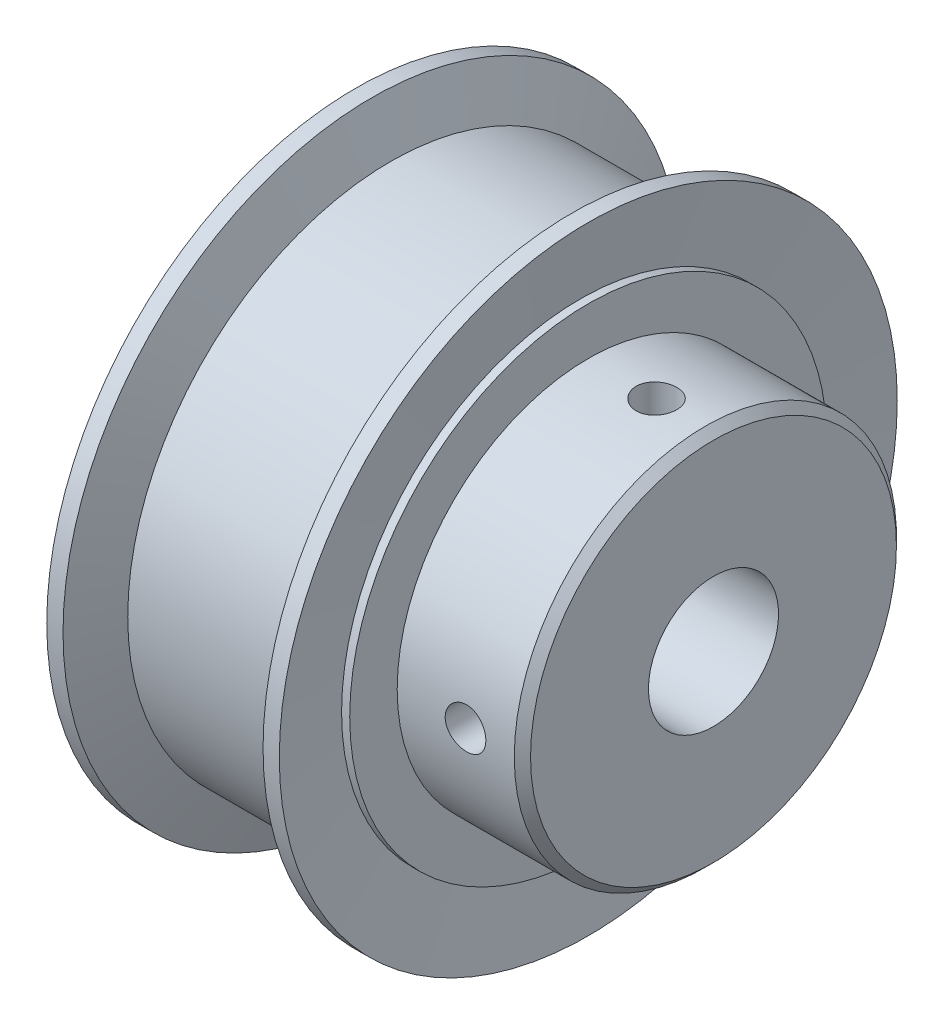
ISO-10303-21;
HEADER;
FILE_DESCRIPTION(('STEP AP214'),'2;1');
FILE_NAME('part.step','',(''),(''),'','','');
FILE_SCHEMA(('AUTOMOTIVE_DESIGN { 1 0 10303 214 1 1 1 1 }'));
ENDSEC;
DATA;
#1=APPLICATION_CONTEXT('core data for automotive mechanical design processes');
#2=APPLICATION_PROTOCOL_DEFINITION('international standard','automotive_design',2000,#1);
#3=PRODUCT_CONTEXT('',#1,'mechanical');
#4=PRODUCT('Part','Part','',(#3));
#5=PRODUCT_RELATED_PRODUCT_CATEGORY('part','',(#4));
#6=PRODUCT_DEFINITION_FORMATION('','',#4);
#7=PRODUCT_DEFINITION_CONTEXT('part definition',#1,'design');
#8=PRODUCT_DEFINITION('design','',#6,#7);
#9=PRODUCT_DEFINITION_SHAPE('','',#8);
#10=(LENGTH_UNIT() NAMED_UNIT(*) SI_UNIT(.MILLI.,.METRE.));
#11=(NAMED_UNIT(*) PLANE_ANGLE_UNIT() SI_UNIT($,.RADIAN.));
#12=(NAMED_UNIT(*) SI_UNIT($,.STERADIAN.) SOLID_ANGLE_UNIT());
#13=UNCERTAINTY_MEASURE_WITH_UNIT(LENGTH_MEASURE(1.E-05),#10,'distance_accuracy_value','');
#14=(GEOMETRIC_REPRESENTATION_CONTEXT(3) GLOBAL_UNCERTAINTY_ASSIGNED_CONTEXT((#13)) GLOBAL_UNIT_ASSIGNED_CONTEXT((#10,
#11,#12)) REPRESENTATION_CONTEXT('',''));
#15=CARTESIAN_POINT('',(0.,0.,0.));
#16=DIRECTION('',(0.,0.,1.));
#17=DIRECTION('',(1.,0.,0.));
#18=AXIS2_PLACEMENT_3D('',#15,#16,#17);
#19=CARTESIAN_POINT('',(0.,0.,0.));
#20=DIRECTION('',(-1.,0.,0.));
#21=DIRECTION('',(0.,0.,1.));
#22=AXIS2_PLACEMENT_3D('',#19,#20,#21);
#23=CYLINDRICAL_SURFACE('',#22,4.);
#24=CARTESIAN_POINT('',(11.35,3.79967103839267,1.24999999999998));
#25=CARTESIAN_POINT('',(11.4183470361093,3.79967145961937,1.24999953780045));
#26=CARTESIAN_POINT('',(11.4866987687032,3.80153531505043,1.24437538791492));
#27=CARTESIAN_POINT('',(11.6213941608778,3.80875638998877,1.22209175401325));
#28=CARTESIAN_POINT('',(11.6877372727322,3.81411455353136,1.20542928782513));
#29=CARTESIAN_POINT('',(11.816444901932,3.8276593883596,1.16169788223557));
#30=CARTESIAN_POINT('',(11.8788162331057,3.83584105194317,1.13464735736675));
#31=CARTESIAN_POINT('',(11.998152695864,3.85410406218689,1.07096914173155));
#32=CARTESIAN_POINT('',(12.0551168699601,3.86418574435841,1.0343397590563));
#33=CARTESIAN_POINT('',(12.1639788674935,3.8855012766862,0.951196070622274));
#34=CARTESIAN_POINT('',(12.215663609436,3.89676123384781,0.90440939972038));
#35=CARTESIAN_POINT('',(12.3105960132092,3.91894245860336,0.802862046455477));
#36=CARTESIAN_POINT('',(12.3538424969448,3.92986367872627,0.748100252518549));
#37=CARTESIAN_POINT('',(12.4316110630112,3.95043553390078,0.630625912493347));
#38=CARTESIAN_POINT('',(12.4659137038314,3.9600518456278,0.56776155652008));
#39=CARTESIAN_POINT('',(12.5233760498555,3.97662551833019,0.436804232853389));
#40=CARTESIAN_POINT('',(12.5465383741496,3.98358350419919,0.368712498487037));
#41=CARTESIAN_POINT('',(12.5803511280971,3.99387175820862,0.231464356966084));
#42=CARTESIAN_POINT('',(12.5913657497878,3.99730738984143,0.162405715468202));
#43=CARTESIAN_POINT('',(12.6017243464375,4.00053595876015,0.0233408139845076));
#44=CARTESIAN_POINT('',(12.6010709743588,4.00032972410065,-0.0466652269730958));
#45=CARTESIAN_POINT('',(12.588351708414,3.99637116132537,-0.183074480354746));
#46=CARTESIAN_POINT('',(12.576680616487,3.99274150972157,-0.249518634314055));
#47=CARTESIAN_POINT('',(12.542905009957,3.98249482560854,-0.37945306334778));
#48=CARTESIAN_POINT('',(12.5207998149134,3.97587759827134,-0.442943145481206));
#49=CARTESIAN_POINT('',(12.4665298109251,3.96023459729532,-0.566078103154791));
#50=CARTESIAN_POINT('',(12.434245191437,3.95118033616957,-0.62566640562284));
#51=CARTESIAN_POINT('',(12.3606289002954,3.93161722953562,-0.738702511152038));
#52=CARTESIAN_POINT('',(12.3192949408622,3.92110801644584,-0.792148756208846));
#53=CARTESIAN_POINT('',(12.2267263651987,3.89923670734646,-0.893737698453889));
#54=CARTESIAN_POINT('',(12.1751509311588,3.88785731989083,-0.941566549094186));
#55=CARTESIAN_POINT('',(12.0646048981755,3.86590615440412,-1.02798974259538));
#56=CARTESIAN_POINT('',(12.005633429425,3.85533447159846,-1.06658299775342));
#57=CARTESIAN_POINT('',(11.8810825311402,3.83610846648973,-1.13380465019766));
#58=CARTESIAN_POINT('',(11.8154365909576,3.82747690354323,-1.16231680702683));
#59=CARTESIAN_POINT('',(11.6799405081046,3.81337545338913,-1.20778345948514));
#60=CARTESIAN_POINT('',(11.6100918857895,3.80790443033293,-1.22474210765794));
#61=CARTESIAN_POINT('',(11.4711800474342,3.80099563391872,-1.24601485185709));
#62=CARTESIAN_POINT('',(11.4021980037679,3.79940466389696,-1.25080954353711));
#63=CARTESIAN_POINT('',(11.2644102585018,3.80001077463984,-1.24896744498308));
#64=CARTESIAN_POINT('',(11.1956045312995,3.80220727008389,-1.24233242111456));
#65=CARTESIAN_POINT('',(11.0621917033484,3.80998957482874,-1.21824873513144));
#66=CARTESIAN_POINT('',(10.997520725926,3.81547554101731,-1.20111831160538));
#67=CARTESIAN_POINT('',(10.871978208004,3.8291128733166,-1.15690373661028));
#68=CARTESIAN_POINT('',(10.8111072890788,3.83726467412387,-1.12981796171155));
#69=CARTESIAN_POINT('',(10.6929608902283,3.85560539653156,-1.06557510655875));
#70=CARTESIAN_POINT('',(10.6358385844072,3.86584603489733,-1.02815147488558));
#71=CARTESIAN_POINT('',(10.5285096536381,3.88710348972828,-0.944606408679819));
#72=CARTESIAN_POINT('',(10.4783048310747,3.89812050735702,-0.898482714690792));
#73=CARTESIAN_POINT('',(10.3840896340872,3.92024187562679,-0.796572947753614));
#74=CARTESIAN_POINT('',(10.3404222138601,3.93133092285679,-0.740465649788531));
#75=CARTESIAN_POINT('',(10.2631089566787,3.95189059843678,-0.621451545651409));
#76=CARTESIAN_POINT('',(10.229462660689,3.96136130090946,-0.558545051108635));
#77=CARTESIAN_POINT('',(10.1734694375283,3.97756311928512,-0.428105523331844));
#78=CARTESIAN_POINT('',(10.1510407121563,3.984313995612,-0.360610184283768));
#79=CARTESIAN_POINT('',(10.1179274614103,3.99440242648576,-0.222557254056403));
#80=CARTESIAN_POINT('',(10.1072392609165,3.99774104914277,-0.15200062834037));
#81=CARTESIAN_POINT('',(10.0982089982504,4.00055803404461,-0.0129849366489136));
#82=CARTESIAN_POINT('',(10.0993715498292,4.0001912940739,0.0554391919465069));
#83=CARTESIAN_POINT('',(10.1128118110487,3.99600978081048,0.191073221923232));
#84=CARTESIAN_POINT('',(10.125088795992,3.99219523232619,0.258283202179552));
#85=CARTESIAN_POINT('',(10.1600940092223,3.98159570844796,0.388755118480774));
#86=CARTESIAN_POINT('',(10.1826896078454,3.97484847960205,0.452055918449464));
#87=CARTESIAN_POINT('',(10.2375708272085,3.9590794558795,0.573998425500074));
#88=CARTESIAN_POINT('',(10.2698581099734,3.95005727091358,0.632639331274464));
#89=CARTESIAN_POINT('',(10.3444727583444,3.93029896883376,0.74576169496967));
#90=CARTESIAN_POINT('',(10.387103522464,3.91951509750962,0.800034607053093));
#91=CARTESIAN_POINT('',(10.4806598894435,3.89758736547061,0.9008207913993));
#92=CARTESIAN_POINT('',(10.5315879741394,3.88644339784827,0.947331733504141));
#93=CARTESIAN_POINT('',(10.6423157198411,3.86461892577438,1.03282865911251));
#94=CARTESIAN_POINT('',(10.7023534031166,3.85396600863456,1.07151427994709));
#95=CARTESIAN_POINT('',(10.8283981202691,3.83480125279531,1.13820470748519));
#96=CARTESIAN_POINT('',(10.8944027264503,3.82628854861387,1.16621383403544));
#97=CARTESIAN_POINT('',(11.0247226173147,3.81306560440328,1.2087118043579));
#98=CARTESIAN_POINT('',(11.0887025474516,3.80809315043749,1.22414939837871));
#99=CARTESIAN_POINT('',(11.2184538320965,3.80139606482399,1.24479245816098));
#100=CARTESIAN_POINT('',(11.2842247412015,3.79967063301599,1.25000044480776));
#101=CARTESIAN_POINT('',(11.35,3.79967103839267,1.24999999999998));
#102=B_SPLINE_CURVE_WITH_KNOTS('',3,(#24,#25,#26,#27,#28,#29,#30,#31,#32,#33,#34,#35,#36,#37,
#38,#39,#40,#41,#42,#43,#44,#45,#46,#47,#48,#49,#50,#51,#52,#53,#54,#55,#56,#57,#58,#59,#60,#61,
#62,#63,#64,#65,#66,#67,#68,#69,#70,#71,#72,#73,#74,#75,#76,#77,#78,#79,#80,#81,#82,#83,#84,#85,
#86,#87,#88,#89,#90,#91,#92,#93,#94,#95,#96,#97,#98,#99,#100,#101),.UNSPECIFIED.,.T.,.F.,(4,2,2,
2,2,2,2,2,2,2,2,2,2,2,2,2,2,2,2,2,2,2,2,2,2,2,2,2,2,2,2,2,2,2,2,2,2,2,4),(0.,0.204798137548489,
0.409651627059732,0.614143644118576,0.818671804924942,1.02957080550837,1.24049922941122,
1.45619821963732,1.67184647417921,1.88083722835532,2.08978046471773,2.29150982969749,
2.49325235190092,2.69746404608407,2.90172742713186,3.11450338937332,3.32730439853774,
3.54248470934452,3.7575876395275,3.96404933287933,4.17047912219087,4.37093972044361,
4.57143302253207,4.77767613309608,4.98397288011877,5.19881937811508,5.41365603317083,
5.62690239290995,5.84008198140581,6.04438802439521,6.24868074692303,6.45041846514756,
6.65219079911648,6.86080693105211,7.06948557772186,7.28507795501701,7.50058300803818,
7.69772354371382,7.89481549188775),.UNSPECIFIED.);
#103=CARTESIAN_POINT('',(11.35,3.79967103839267,1.24999999999998));
#104=VERTEX_POINT('',#103);
#105=EDGE_CURVE('E224',#104,#104,#102,.T.);
#106=ORIENTED_EDGE('',*,*,#105,.T.);
#107=EDGE_LOOP('',(#106));
#108=FACE_BOUND('',#107,.T.);
#109=CARTESIAN_POINT('',(12.6,0.,4.));
#110=CARTESIAN_POINT('',(12.5999995534124,0.068439185174546,3.99999965877989));
#111=CARTESIAN_POINT('',(12.5943607730555,0.136883052502858,3.99822694984841));
#112=CARTESIAN_POINT('',(12.5720137584608,0.271769209588446,3.99132894088807));
#113=CARTESIAN_POINT('',(12.5553030186356,0.338211042725905,3.98620288199859));
#114=CARTESIAN_POINT('',(12.5114306288043,0.467128543650804,3.97315815697909));
#115=CARTESIAN_POINT('',(12.484285155347,0.5296101769858,3.96524381499025));
#116=CARTESIAN_POINT('',(12.4203826823217,0.649134802346456,3.94743969161092));
#117=CARTESIAN_POINT('',(12.3836241682194,0.70617693544488,3.93754959899905));
#118=CARTESIAN_POINT('',(12.3003440079826,0.814965334952275,3.91650213740282));
#119=CARTESIAN_POINT('',(12.2535791149389,0.866520028156654,3.90531715926989));
#120=CARTESIAN_POINT('',(12.1521316075864,0.961197382036987,3.88310046374209));
#121=CARTESIAN_POINT('',(12.0974475225054,1.00431847289869,3.87206877523457));
#122=CARTESIAN_POINT('',(11.9800554361919,1.08194336483113,3.85111144698172));
#123=CARTESIAN_POINT('',(11.9171825224728,1.11620784150128,3.84121988301796));
#124=CARTESIAN_POINT('',(11.7862076850181,1.17359741076671,3.82407801799234));
#125=CARTESIAN_POINT('',(11.7181071442061,1.19672543771944,3.81682702128689));
#126=CARTESIAN_POINT('',(11.5807719225479,1.23048459930033,3.80607606984501));
#127=CARTESIAN_POINT('',(11.5116331563611,1.24147110007864,3.80246972929508));
#128=CARTESIAN_POINT('',(11.3724068810881,1.25174555036987,3.7991005514095));
#129=CARTESIAN_POINT('',(11.3023196291783,1.25103660995771,3.79933669227334));
#130=CARTESIAN_POINT('',(11.166125539731,1.23821824732739,3.80353189075438));
#131=CARTESIAN_POINT('',(11.0999708741384,1.22656057869382,3.80734341745949));
#132=CARTESIAN_POINT('',(10.9706078434627,1.19290813355625,3.81802025652489));
#133=CARTESIAN_POINT('',(10.9073997922912,1.1709122584455,3.82488589343115));
#134=CARTESIAN_POINT('',(10.7846480555674,1.11688874681277,3.84101044014296));
#135=CARTESIAN_POINT('',(10.725171389308,1.08471925662081,3.85030284660824));
#136=CARTESIAN_POINT('',(10.6123122321209,1.01136020737848,3.8702185658007));
#137=CARTESIAN_POINT('',(10.5589313297463,0.970168305215767,3.88084222394551));
#138=CARTESIAN_POINT('',(10.457225056583,0.877716954182119,3.90281527800493));
#139=CARTESIAN_POINT('',(10.4092404422203,0.826084570592813,3.91417569605696));
#140=CARTESIAN_POINT('',(10.3225281064203,0.715364408095528,3.9359157075958));
#141=CARTESIAN_POINT('',(10.2838010707808,0.656276077349018,3.94629522838372));
#142=CARTESIAN_POINT('',(10.2164723113987,0.531664610465452,3.96501294890191));
#143=CARTESIAN_POINT('',(10.187951864536,0.466094906919277,3.97333460648208));
#144=CARTESIAN_POINT('',(10.1424469991484,0.330767977782642,3.98687955828554));
#145=CARTESIAN_POINT('',(10.1254590777616,0.261012030724607,3.99210379325151));
#146=CARTESIAN_POINT('',(10.104081957421,0.122185157290344,3.99871389395014));
#147=CARTESIAN_POINT('',(10.0992314564065,0.0531918487888423,4.00024022895439));
#148=CARTESIAN_POINT('',(10.1009662266373,-0.084630305732584,3.99969799730981));
#149=CARTESIAN_POINT('',(10.1075498273226,-0.153459174306504,3.99762995581124));
#150=CARTESIAN_POINT('',(10.1315955926064,-0.28721933297585,3.99022363769771));
#151=CARTESIAN_POINT('',(10.1487832676125,-0.352204978420946,3.98496793110724));
#152=CARTESIAN_POINT('',(10.1932143523667,-0.478351928861363,3.97180121379252));
#153=CARTESIAN_POINT('',(10.2204590040249,-0.539512760449013,3.96388987514203));
#154=CARTESIAN_POINT('',(10.2849732165488,-0.657932406672228,3.94598542759568));
#155=CARTESIAN_POINT('',(10.3224709874972,-0.71505973978795,3.9359462681821));
#156=CARTESIAN_POINT('',(10.406153210117,-0.82236585096009,3.91493410002887));
#157=CARTESIAN_POINT('',(10.4523400177431,-0.87254273804333,3.90396083845862));
#158=CARTESIAN_POINT('',(10.5542588900537,-0.96658746291965,3.88176994885247));
#159=CARTESIAN_POINT('',(10.6102966637453,-1.01012652339773,3.87055986714446));
#160=CARTESIAN_POINT('',(10.7291266163707,-1.08721250244908,3.84961947087602));
#161=CARTESIAN_POINT('',(10.7919186880044,-1.12075957972523,3.839889132814));
#162=CARTESIAN_POINT('',(10.9223451728859,-1.1767008348114,3.82311782360754));
#163=CARTESIAN_POINT('',(10.9899596495047,-1.19913819558885,3.81606646468027));
#164=CARTESIAN_POINT('',(11.1282724933238,-1.23222894320963,3.80551170941212));
#165=CARTESIAN_POINT('',(11.1989696763713,-1.24288681414609,3.80200696302675));
#166=CARTESIAN_POINT('',(11.3380040875542,-1.2517940615754,3.79908292712494));
#167=CARTESIAN_POINT('',(11.4063034538129,-1.25058279621956,3.79948604683077));
#168=CARTESIAN_POINT('',(11.5416745849192,-1.23708818129473,3.80390090472383));
#169=CARTESIAN_POINT('',(11.608746406884,-1.22480534822559,3.80791247457319));
#170=CARTESIAN_POINT('',(11.7387940396018,-1.18987729913377,3.81896814158112));
#171=CARTESIAN_POINT('',(11.801815441096,-1.16738642405943,3.82596698183474));
#172=CARTESIAN_POINT('',(11.9232404135313,-1.11280227335063,3.84219704261348));
#173=CARTESIAN_POINT('',(11.9816430420777,-1.08070704444254,3.85142871716522));
#174=CARTESIAN_POINT('',(12.0946459704406,-1.00635675013474,3.8715348703158));
#175=CARTESIAN_POINT('',(12.1490081295004,-0.963753335241268,3.88245948922441));
#176=CARTESIAN_POINT('',(12.2499863281118,-0.870208996404843,3.90448998821726));
#177=CARTESIAN_POINT('',(12.296600288991,-0.819265842344397,3.91559591606795));
#178=CARTESIAN_POINT('',(12.382282538363,-0.708486662823327,3.93717271952329));
#179=CARTESIAN_POINT('',(12.42105473645,-0.648414574487376,3.94761101730634));
#180=CARTESIAN_POINT('',(12.4878989151394,-0.52227913801365,3.96626769296916));
#181=CARTESIAN_POINT('',(12.5159751021418,-0.456218157795446,3.97448694315832));
#182=CARTESIAN_POINT('',(12.5585913676085,-0.325747635373975,3.98720650733461));
#183=CARTESIAN_POINT('',(12.5740748673053,-0.261670337112544,3.99196240806139));
#184=CARTESIAN_POINT('',(12.5947783599677,-0.131729895440247,3.99835900340486));
#185=CARTESIAN_POINT('',(12.600000429804,-0.0658671161396743,4.00000032839643));
#186=CARTESIAN_POINT('',(12.6,0.,4.));
#187=B_SPLINE_CURVE_WITH_KNOTS('',3,(#109,#110,#111,#112,#113,#114,#115,#116,#117,#118,#119,
#120,#121,#122,#123,#124,#125,#126,#127,#128,#129,#130,#131,#132,#133,#134,#135,#136,#137,#138,
#139,#140,#141,#142,#143,#144,#145,#146,#147,#148,#149,#150,#151,#152,#153,#154,#155,#156,#157,
#158,#159,#160,#161,#162,#163,#164,#165,#166,#167,#168,#169,#170,#171,#172,#173,#174,#175,#176,
#177,#178,#179,#180,#181,#182,#183,#184,#185,#186),.UNSPECIFIED.,.T.,.F.,(4,2,2,2,2,2,2,2,2,2,2,
2,2,2,2,2,2,2,2,2,2,2,2,2,2,2,2,2,2,2,2,2,2,2,2,2,2,2,4),(0.,0.205075449432509,
0.410197323349064,0.615002479202432,0.819839921558386,1.03037822195158,1.24095567431275,
1.45673771247493,1.67246286279526,1.88169150167209,2.09086450295137,2.29176917422168,
2.49269519979061,2.69655642720544,2.90047066010357,3.11366747279598,3.32688007413301,
3.54175460689768,3.75656384494552,3.96307568548235,4.1695573564936,4.3709062672287,
4.57228005034497,4.7785632473834,4.98490245709256,5.19941778713137,5.41392970983709,
5.62760115751028,5.84119123892427,6.0451220347605,6.24904331751081,6.44997913396667,
6.6509558433017,6.85979514006358,7.06869037373336,7.28440668126408,7.50003806666333,
7.69744636651537,7.89481470763043),.UNSPECIFIED.);
#188=CARTESIAN_POINT('',(12.6,0.,4.));
#189=VERTEX_POINT('',#188);
#190=EDGE_CURVE('E95',#189,#189,#187,.T.);
#191=ORIENTED_EDGE('',*,*,#190,.T.);
#192=EDGE_LOOP('',(#191));
#193=FACE_BOUND('',#192,.T.);
#194=CARTESIAN_POINT('',(14.85,0.,0.));
#195=DIRECTION('',(-1.,0.,0.));
#196=DIRECTION('',(0.,0.,1.));
#197=AXIS2_PLACEMENT_3D('',#194,#195,#196);
#198=CIRCLE('',#197,4.);
#199=CARTESIAN_POINT('',(14.85,0.,4.));
#200=VERTEX_POINT('',#199);
#201=EDGE_CURVE('E85',#200,#200,#198,.T.);
#202=ORIENTED_EDGE('',*,*,#201,.F.);
#203=EDGE_LOOP('',(#202));
#204=FACE_BOUND('',#203,.T.);
#205=CARTESIAN_POINT('',(-7.15,0.,0.));
#206=DIRECTION('',(-1.,0.,0.));
#207=DIRECTION('',(0.,0.,1.));
#208=AXIS2_PLACEMENT_3D('',#205,#206,#207);
#209=CIRCLE('',#208,4.);
#210=CARTESIAN_POINT('',(-7.15,0.,4.));
#211=VERTEX_POINT('',#210);
#212=EDGE_CURVE('E46',#211,#211,#209,.T.);
#213=ORIENTED_EDGE('',*,*,#212,.T.);
#214=EDGE_LOOP('',(#213));
#215=FACE_BOUND('',#214,.T.);
#216=ADVANCED_FACE('F35',(#108,#193,#204,#215),#23,.F.);
#217=CARTESIAN_POINT('',(-7.15,4.,0.));
#218=DIRECTION('',(1.,0.,0.));
#219=DIRECTION('',(0.,0.,-1.));
#220=AXIS2_PLACEMENT_3D('',#217,#218,#219);
#221=PLANE('',#220);
#222=ORIENTED_EDGE('',*,*,#212,.F.);
#223=EDGE_LOOP('',(#222));
#224=FACE_BOUND('',#223,.T.);
#225=CARTESIAN_POINT('',(-7.15,0.,0.));
#226=DIRECTION('',(-1.,0.,0.));
#227=DIRECTION('',(0.,0.,1.));
#228=AXIS2_PLACEMENT_3D('',#225,#226,#227);
#229=CIRCLE('',#228,14.67);
#230=CARTESIAN_POINT('',(-7.15,0.,14.67));
#231=VERTEX_POINT('',#230);
#232=EDGE_CURVE('E50',#231,#231,#229,.T.);
#233=ORIENTED_EDGE('',*,*,#232,.T.);
#234=EDGE_LOOP('',(#233));
#235=FACE_BOUND('',#234,.T.);
#236=ADVANCED_FACE('F125',(#224,#235),#221,.F.);
#237=CARTESIAN_POINT('',(0.,0.,0.));
#238=DIRECTION('',(-1.,0.,0.));
#239=DIRECTION('',(0.,0.,1.));
#240=AXIS2_PLACEMENT_3D('',#237,#238,#239);
#241=CYLINDRICAL_SURFACE('',#240,14.67);
#242=ORIENTED_EDGE('',*,*,#232,.F.);
#243=EDGE_LOOP('',(#242));
#244=FACE_BOUND('',#243,.T.);
#245=CARTESIAN_POINT('',(-6.65,0.,0.));
#246=DIRECTION('',(-1.,0.,0.));
#247=DIRECTION('',(0.,0.,1.));
#248=AXIS2_PLACEMENT_3D('',#245,#246,#247);
#249=CIRCLE('',#248,14.67);
#250=CARTESIAN_POINT('',(-6.65,0.,14.67));
#251=VERTEX_POINT('',#250);
#252=EDGE_CURVE('E55',#251,#251,#249,.T.);
#253=ORIENTED_EDGE('',*,*,#252,.T.);
#254=EDGE_LOOP('',(#253));
#255=FACE_BOUND('',#254,.T.);
#256=ADVANCED_FACE('F130',(#244,#255),#241,.T.);
#257=CARTESIAN_POINT('',(-7.15,0.,0.));
#258=DIRECTION('',(-1.,0.,0.));
#259=DIRECTION('',(0.,0.,1.));
#260=AXIS2_PLACEMENT_3D('',#257,#258,#259);
#261=CONICAL_SURFACE('',#260,19.,1.45583206359421);
#262=ORIENTED_EDGE('',*,*,#252,.F.);
#263=EDGE_LOOP('',(#262));
#264=FACE_BOUND('',#263,.T.);
#265=CARTESIAN_POINT('',(-7.15,0.,0.));
#266=DIRECTION('',(-1.,0.,0.));
#267=DIRECTION('',(0.,0.,1.));
#268=AXIS2_PLACEMENT_3D('',#265,#266,#267);
#269=CIRCLE('',#268,19.);
#270=CARTESIAN_POINT('',(-7.15,0.,19.));
#271=VERTEX_POINT('',#270);
#272=EDGE_CURVE('E58',#271,#271,#269,.T.);
#273=ORIENTED_EDGE('',*,*,#272,.T.);
#274=EDGE_LOOP('',(#273));
#275=FACE_BOUND('',#274,.T.);
#276=ADVANCED_FACE('F138',(#264,#275),#261,.F.);
#277=CARTESIAN_POINT('',(0.,0.,0.));
#278=DIRECTION('',(-1.,0.,0.));
#279=DIRECTION('',(0.,0.,1.));
#280=AXIS2_PLACEMENT_3D('',#277,#278,#279);
#281=CYLINDRICAL_SURFACE('',#280,19.);
#282=ORIENTED_EDGE('',*,*,#272,.F.);
#283=EDGE_LOOP('',(#282));
#284=FACE_BOUND('',#283,.T.);
#285=CARTESIAN_POINT('',(-6.15,0.,0.));
#286=DIRECTION('',(-1.,0.,0.));
#287=DIRECTION('',(0.,0.,1.));
#288=AXIS2_PLACEMENT_3D('',#285,#286,#287);
#289=CIRCLE('',#288,19.);
#290=CARTESIAN_POINT('',(-6.15,0.,19.));
#291=VERTEX_POINT('',#290);
#292=EDGE_CURVE('E61',#291,#291,#289,.T.);
#293=ORIENTED_EDGE('',*,*,#292,.T.);
#294=EDGE_LOOP('',(#293));
#295=FACE_BOUND('',#294,.T.);
#296=ADVANCED_FACE('F142',(#284,#295),#281,.T.);
#297=CARTESIAN_POINT('',(-5.,0.,0.));
#298=DIRECTION('',(-1.,0.,0.));
#299=DIRECTION('',(0.,0.,1.));
#300=AXIS2_PLACEMENT_3D('',#297,#298,#299);
#301=CONICAL_SURFACE('',#300,16.17,1.18481887965092);
#302=ORIENTED_EDGE('',*,*,#292,.F.);
#303=EDGE_LOOP('',(#302));
#304=FACE_BOUND('',#303,.T.);
#305=CARTESIAN_POINT('',(-5.,0.,0.));
#306=DIRECTION('',(-1.,0.,0.));
#307=DIRECTION('',(0.,0.,1.));
#308=AXIS2_PLACEMENT_3D('',#305,#306,#307);
#309=CIRCLE('',#308,16.17);
#310=CARTESIAN_POINT('',(-5.,0.,16.17));
#311=VERTEX_POINT('',#310);
#312=EDGE_CURVE('E64',#311,#311,#309,.T.);
#313=ORIENTED_EDGE('',*,*,#312,.T.);
#314=EDGE_LOOP('',(#313));
#315=FACE_BOUND('',#314,.T.);
#316=ADVANCED_FACE('F146',(#304,#315),#301,.T.);
#317=CARTESIAN_POINT('',(0.,0.,0.));
#318=DIRECTION('',(-1.,0.,0.));
#319=DIRECTION('',(0.,0.,1.));
#320=AXIS2_PLACEMENT_3D('',#317,#318,#319);
#321=CYLINDRICAL_SURFACE('',#320,16.17);
#322=ORIENTED_EDGE('',*,*,#312,.F.);
#323=EDGE_LOOP('',(#322));
#324=FACE_BOUND('',#323,.T.);
#325=CARTESIAN_POINT('',(5.,0.,0.));
#326=DIRECTION('',(-1.,0.,0.));
#327=DIRECTION('',(0.,0.,1.));
#328=AXIS2_PLACEMENT_3D('',#325,#326,#327);
#329=CIRCLE('',#328,16.17);
#330=CARTESIAN_POINT('',(5.,0.,16.17));
#331=VERTEX_POINT('',#330);
#332=EDGE_CURVE('E67',#331,#331,#329,.T.);
#333=ORIENTED_EDGE('',*,*,#332,.T.);
#334=EDGE_LOOP('',(#333));
#335=FACE_BOUND('',#334,.T.);
#336=ADVANCED_FACE('F150',(#324,#335),#321,.T.);
#337=CARTESIAN_POINT('',(6.15,0.,0.));
#338=DIRECTION('',(1.,0.,0.));
#339=DIRECTION('',(0.,0.,-1.));
#340=AXIS2_PLACEMENT_3D('',#337,#338,#339);
#341=CONICAL_SURFACE('',#340,19.,1.18481887965092);
#342=ORIENTED_EDGE('',*,*,#332,.F.);
#343=EDGE_LOOP('',(#342));
#344=FACE_BOUND('',#343,.T.);
#345=CARTESIAN_POINT('',(6.15,0.,0.));
#346=DIRECTION('',(-1.,0.,0.));
#347=DIRECTION('',(0.,0.,1.));
#348=AXIS2_PLACEMENT_3D('',#345,#346,#347);
#349=CIRCLE('',#348,19.);
#350=CARTESIAN_POINT('',(6.15,0.,19.));
#351=VERTEX_POINT('',#350);
#352=EDGE_CURVE('E70',#351,#351,#349,.T.);
#353=ORIENTED_EDGE('',*,*,#352,.T.);
#354=EDGE_LOOP('',(#353));
#355=FACE_BOUND('',#354,.T.);
#356=ADVANCED_FACE('F154',(#344,#355),#341,.T.);
#357=CARTESIAN_POINT('',(0.,0.,0.));
#358=DIRECTION('',(-1.,0.,0.));
#359=DIRECTION('',(0.,0.,1.));
#360=AXIS2_PLACEMENT_3D('',#357,#358,#359);
#361=CYLINDRICAL_SURFACE('',#360,19.);
#362=ORIENTED_EDGE('',*,*,#352,.F.);
#363=EDGE_LOOP('',(#362));
#364=FACE_BOUND('',#363,.T.);
#365=CARTESIAN_POINT('',(7.15,0.,0.));
#366=DIRECTION('',(-1.,0.,0.));
#367=DIRECTION('',(0.,0.,1.));
#368=AXIS2_PLACEMENT_3D('',#365,#366,#367);
#369=CIRCLE('',#368,19.);
#370=CARTESIAN_POINT('',(7.15,0.,19.));
#371=VERTEX_POINT('',#370);
#372=EDGE_CURVE('E73',#371,#371,#369,.T.);
#373=ORIENTED_EDGE('',*,*,#372,.T.);
#374=EDGE_LOOP('',(#373));
#375=FACE_BOUND('',#374,.T.);
#376=ADVANCED_FACE('F158',(#364,#375),#361,.T.);
#377=CARTESIAN_POINT('',(6.65,0.,0.));
#378=DIRECTION('',(1.,0.,0.));
#379=DIRECTION('',(0.,0.,-1.));
#380=AXIS2_PLACEMENT_3D('',#377,#378,#379);
#381=CONICAL_SURFACE('',#380,14.67,1.45583206359421);
#382=ORIENTED_EDGE('',*,*,#372,.F.);
#383=EDGE_LOOP('',(#382));
#384=FACE_BOUND('',#383,.T.);
#385=CARTESIAN_POINT('',(6.65,0.,0.));
#386=DIRECTION('',(-1.,0.,0.));
#387=DIRECTION('',(0.,0.,1.));
#388=AXIS2_PLACEMENT_3D('',#385,#386,#387);
#389=CIRCLE('',#388,14.67);
#390=CARTESIAN_POINT('',(6.65,0.,14.67));
#391=VERTEX_POINT('',#390);
#392=EDGE_CURVE('E76',#391,#391,#389,.T.);
#393=ORIENTED_EDGE('',*,*,#392,.T.);
#394=EDGE_LOOP('',(#393));
#395=FACE_BOUND('',#394,.T.);
#396=ADVANCED_FACE('F162',(#384,#395),#381,.F.);
#397=CARTESIAN_POINT('',(0.,0.,0.));
#398=DIRECTION('',(-1.,0.,0.));
#399=DIRECTION('',(0.,0.,1.));
#400=AXIS2_PLACEMENT_3D('',#397,#398,#399);
#401=CYLINDRICAL_SURFACE('',#400,14.67);
#402=ORIENTED_EDGE('',*,*,#392,.F.);
#403=EDGE_LOOP('',(#402));
#404=FACE_BOUND('',#403,.T.);
#405=CARTESIAN_POINT('',(7.15,0.,0.));
#406=DIRECTION('',(-1.,0.,0.));
#407=DIRECTION('',(0.,0.,1.));
#408=AXIS2_PLACEMENT_3D('',#405,#406,#407);
#409=CIRCLE('',#408,14.67);
#410=CARTESIAN_POINT('',(7.15,0.,14.67));
#411=VERTEX_POINT('',#410);
#412=EDGE_CURVE('E79',#411,#411,#409,.T.);
#413=ORIENTED_EDGE('',*,*,#412,.T.);
#414=EDGE_LOOP('',(#413));
#415=FACE_BOUND('',#414,.T.);
#416=ADVANCED_FACE('F166',(#404,#415),#401,.T.);
#417=CARTESIAN_POINT('',(7.15,14.67,0.));
#418=DIRECTION('',(-1.,0.,0.));
#419=DIRECTION('',(0.,0.,1.));
#420=AXIS2_PLACEMENT_3D('',#417,#418,#419);
#421=PLANE('',#420);
#422=ORIENTED_EDGE('',*,*,#412,.F.);
#423=EDGE_LOOP('',(#422));
#424=FACE_BOUND('',#423,.T.);
#425=CARTESIAN_POINT('',(7.15,0.,0.));
#426=DIRECTION('',(-1.,0.,0.));
#427=DIRECTION('',(0.,0.,1.));
#428=AXIS2_PLACEMENT_3D('',#425,#426,#427);
#429=CIRCLE('',#428,11.75);
#430=CARTESIAN_POINT('',(7.15,0.,11.75));
#431=VERTEX_POINT('',#430);
#432=EDGE_CURVE('E82',#431,#431,#429,.T.);
#433=ORIENTED_EDGE('',*,*,#432,.T.);
#434=EDGE_LOOP('',(#433));
#435=FACE_BOUND('',#434,.T.);
#436=ADVANCED_FACE('F121',(#424,#435),#421,.F.);
#437=CARTESIAN_POINT('',(0.,0.,0.));
#438=DIRECTION('',(-1.,0.,0.));
#439=DIRECTION('',(0.,0.,1.));
#440=AXIS2_PLACEMENT_3D('',#437,#438,#439);
#441=CYLINDRICAL_SURFACE('',#440,11.75);
#442=CARTESIAN_POINT('',(11.35,11.6833214455479,1.24999999999995));
#443=CARTESIAN_POINT('',(11.2800004277012,11.6833223149786,1.24999697992372));
#444=CARTESIAN_POINT('',(11.2099551640088,11.6839573227351,1.2441002597822));
#445=CARTESIAN_POINT('',(11.0718083838737,11.6864282485266,1.22066713024753));
#446=CARTESIAN_POINT('',(11.0037090678007,11.6882654739207,1.20311804911594));
#447=CARTESIAN_POINT('',(10.8714746579072,11.6929304297551,1.15689850122136));
#448=CARTESIAN_POINT('',(10.8073371223797,11.6957575428,1.12823496537722));
#449=CARTESIAN_POINT('',(10.6847966418306,11.702082973934,1.06061385449032));
#450=CARTESIAN_POINT('',(10.6263925981416,11.7055811630486,1.02165825694242));
#451=CARTESIAN_POINT('',(10.516724385779,11.7128706356385,0.934387585336528));
#452=CARTESIAN_POINT('',(10.4654870291183,11.7166629413621,0.886038900103814));
#453=CARTESIAN_POINT('',(10.371837692425,11.7241040937942,0.781426483959415));
#454=CARTESIAN_POINT('',(10.3294261242515,11.7277529338014,0.72516238387687));
#455=CARTESIAN_POINT('',(10.2545386292093,11.7345062313375,0.606150825685571));
#456=CARTESIAN_POINT('',(10.222086579914,11.7376093730935,0.543388261705093));
#457=CARTESIAN_POINT('',(10.1681921111736,11.7429104790326,0.413266051604778));
#458=CARTESIAN_POINT('',(10.1467493906288,11.7451084679708,0.345906531266529));
#459=CARTESIAN_POINT('',(10.1155613029211,11.7483444321313,0.208774383446687));
#460=CARTESIAN_POINT('',(10.1057717407882,11.7493867890847,0.139011912306722));
#461=CARTESIAN_POINT('',(10.098031060592,11.7502089617888,-0.00117307301203623));
#462=CARTESIAN_POINT('',(10.1000795982839,11.7499888142523,-0.0715955679382892));
#463=CARTESIAN_POINT('',(10.1159211996261,11.7483143590013,-0.21080139093408));
#464=CARTESIAN_POINT('',(10.1296667388939,11.7468650454123,-0.279590195747255));
#465=CARTESIAN_POINT('',(10.1684380616632,11.7429008229349,-0.413878946247999));
#466=CARTESIAN_POINT('',(10.1934640080855,11.7403858986562,-0.47937884441936));
#467=CARTESIAN_POINT('',(10.2541374893738,11.7345645598246,-0.605379656528491));
#468=CARTESIAN_POINT('',(10.2898059454786,11.7312565888268,-0.665870421385769));
#469=CARTESIAN_POINT('',(10.3707367529202,11.7242200869399,-0.780025119436146));
#470=CARTESIAN_POINT('',(10.4159994229189,11.7204915420838,-0.833688825780735));
#471=CARTESIAN_POINT('',(10.5151008402656,11.7130102508048,-0.932944650393167));
#472=CARTESIAN_POINT('',(10.5689809479799,11.7092574759708,-0.97849548053072));
#473=CARTESIAN_POINT('',(10.6836446929871,11.7021690619321,-1.05991259068913));
#474=CARTESIAN_POINT('',(10.7444283425861,11.6988334234709,-1.09577885344604));
#475=CARTESIAN_POINT('',(10.8712066600393,11.6929567485068,-1.15680911435305));
#476=CARTESIAN_POINT('',(10.9372026508517,11.6904159145522,-1.18197038502354));
#477=CARTESIAN_POINT('',(11.0725157856645,11.6864206688031,-1.22084283350632));
#478=CARTESIAN_POINT('',(11.1418328147416,11.6849662194436,-1.23455440722937));
#479=CARTESIAN_POINT('',(11.2814573928929,11.6833150220589,-1.25008476341693));
#480=CARTESIAN_POINT('',(11.3517584387685,11.6831121571328,-1.25196138813594));
#481=CARTESIAN_POINT('',(11.491673969582,11.6839709484923,-1.2439206491885));
#482=CARTESIAN_POINT('',(11.5612884650267,11.6850325853956,-1.23400346629737));
#483=CARTESIAN_POINT('',(11.6976850862522,11.6882951926436,-1.20270509152516));
#484=CARTESIAN_POINT('',(11.7644735942845,11.6904934290943,-1.1813514037869));
#485=CARTESIAN_POINT('',(11.8935210446875,11.695779333668,-1.12781430523397));
#486=CARTESIAN_POINT('',(11.9557798700696,11.6988670247529,-1.09563061483211));
#487=CARTESIAN_POINT('',(12.0742638469563,11.7055987071756,-1.02120281817379));
#488=CARTESIAN_POINT('',(12.1304648586546,11.7092447934662,-0.978920475447442));
#489=CARTESIAN_POINT('',(12.2349927197897,11.7166756569374,-0.885550241516862));
#490=CARTESIAN_POINT('',(12.2833193483234,11.7204604380051,-0.83446210336295));
#491=CARTESIAN_POINT('',(12.3709269694683,11.7277607865022,-0.724679137629654));
#492=CARTESIAN_POINT('',(12.4101701634982,11.7312751897416,-0.665954058233957));
#493=CARTESIAN_POINT('',(12.4782365068283,11.7376217540118,-0.542713077613588));
#494=CARTESIAN_POINT('',(12.5070598151132,11.7404539254517,-0.478197264761673));
#495=CARTESIAN_POINT('',(12.5534045327004,11.7451116830125,-0.34533663451831));
#496=CARTESIAN_POINT('',(12.570948539742,11.7469392806937,-0.276999773115607));
#497=CARTESIAN_POINT('',(12.5943103437899,11.7493902488991,-0.138329779396758));
#498=CARTESIAN_POINT('',(12.6001285168759,11.750013658045,-0.0679967111778121));
#499=CARTESIAN_POINT('',(12.5998678057863,11.7499859506803,0.0722984558507889));
#500=CARTESIAN_POINT('',(12.5938475056384,11.749341110244,0.14226067211172));
#501=CARTESIAN_POINT('',(12.5702038784763,11.7468617579593,0.280173673607073));
#502=CARTESIAN_POINT('',(12.5525805458159,11.745027245532,0.348124457862713));
#503=CARTESIAN_POINT('',(12.5062478746714,11.7403739968567,0.480083537009076));
#504=CARTESIAN_POINT('',(12.4775405141936,11.7375554362262,0.544092532971991));
#505=CARTESIAN_POINT('',(12.409860846704,11.7312477866881,0.66639302511753));
#506=CARTESIAN_POINT('',(12.3708885563832,11.7277586988707,0.724684530596684));
#507=CARTESIAN_POINT('',(12.2835661632293,11.7204798972023,0.834195471326659));
#508=CARTESIAN_POINT('',(12.2351724128067,11.716688834626,0.885380014032691));
#509=CARTESIAN_POINT('',(12.1304684898553,11.7092446498703,0.978926930475941));
#510=CARTESIAN_POINT('',(12.0741564269203,11.7055915608956,1.02128719150712));
#511=CARTESIAN_POINT('',(11.9550366291157,11.6988258462483,1.09608048319812));
#512=CARTESIAN_POINT('',(11.8922108871898,11.6957147861861,1.12848495657228));
#513=CARTESIAN_POINT('',(11.7620156383282,11.6904039227684,1.18224041786305));
#514=CARTESIAN_POINT('',(11.6946513096124,11.6882031007014,1.20360376939989));
#515=CARTESIAN_POINT('',(11.5807607353537,11.685512119262,1.22939267268041));
#516=CARTESIAN_POINT('',(11.5349605154259,11.6846945492335,1.23710973206433));
#517=CARTESIAN_POINT('',(11.44278022051,11.6835989255462,1.24741438405964));
#518=CARTESIAN_POINT('',(11.3964001483748,11.6833208692343,1.25000200189769));
#519=CARTESIAN_POINT('',(11.35,11.6833214455479,1.24999999999995));
#520=B_SPLINE_CURVE_WITH_KNOTS('',3,(#442,#443,#444,#445,#446,#447,#448,#449,#450,#451,#452,
#453,#454,#455,#456,#457,#458,#459,#460,#461,#462,#463,#464,#465,#466,#467,#468,#469,#470,#471,
#472,#473,#474,#475,#476,#477,#478,#479,#480,#481,#482,#483,#484,#485,#486,#487,#488,#489,#490,
#491,#492,#493,#494,#495,#496,#497,#498,#499,#500,#501,#502,#503,#504,#505,#506,#507,#508,#509,
#510,#511,#512,#513,#514,#515,#516,#517,#518,#519),.UNSPECIFIED.,.T.,.F.,(4,2,2,2,2,2,2,2,2,2,2,
2,2,2,2,2,2,2,2,2,2,2,2,2,2,2,2,2,2,2,2,2,2,2,2,2,2,2,4),(0.,0.209829257857204,
0.419887075900265,0.629814113046835,0.839700844555094,1.05035292420763,1.26101483182345,
1.47217791759259,1.68333522784737,1.8936891396678,2.10403693455642,2.31353415418355,
2.52303439963419,2.73294922870748,2.94287103097947,3.15383240672689,3.36479415853664,
3.57580962825611,3.78681780112256,3.99679388601609,4.20676675244063,4.41623689881388,
4.6257124532803,4.83599408114221,5.04628160710073,5.25742906465388,5.46857330041973,
5.67929318588816,5.89000631288427,6.0996793259349,6.30935244101278,6.51898815604029,
6.72862353019848,6.93925426027613,7.14993536166771,7.36121525924933,7.57225805454938,
7.71134685553622,7.85043497248069),.UNSPECIFIED.);
#521=CARTESIAN_POINT('',(11.35,11.6833214455479,1.24999999999995));
#522=VERTEX_POINT('',#521);
#523=EDGE_CURVE('E227',#522,#522,#520,.T.);
#524=ORIENTED_EDGE('',*,*,#523,.T.);
#525=EDGE_LOOP('',(#524));
#526=FACE_BOUND('',#525,.T.);
#527=CARTESIAN_POINT('',(12.6,0.,11.75));
#528=CARTESIAN_POINT('',(12.5999969810498,-0.070000836022609,11.7499991486948));
#529=CARTESIAN_POINT('',(12.5941000551881,-0.140047359530185,11.7493678155883));
#530=CARTESIAN_POINT('',(12.5706660342561,-0.278196757154722,11.7469100149164));
#531=CARTESIAN_POINT('',(12.5531162718393,-0.346297431893169,11.7450822467833));
#532=CARTESIAN_POINT('',(12.5068947310427,-0.478534714943107,11.7404378013256));
#533=CARTESIAN_POINT('',(12.4782298512101,-0.542673753457928,11.7376217374849));
#534=CARTESIAN_POINT('',(12.4106055751437,-0.665216753225474,11.7313151903328));
#535=CARTESIAN_POINT('',(12.3716481596953,-0.723621815011528,11.7278248368223));
#536=CARTESIAN_POINT('',(12.2843756502355,-0.833288881316746,11.7205445981736));
#537=CARTESIAN_POINT('',(12.2360273513305,-0.884524395452352,11.7167536792872));
#538=CARTESIAN_POINT('',(12.1314164819526,-0.978170175020681,11.7093080670404));
#539=CARTESIAN_POINT('',(12.0751535372756,-1.0205800229411,11.7056533801313));
#540=CARTESIAN_POINT('',(11.9561429949639,-1.09546571629149,11.6988835831078));
#541=CARTESIAN_POINT('',(11.8933800927446,-1.12791736898583,11.6957697949008));
#542=CARTESIAN_POINT('',(11.7632571475946,-1.18181101123879,11.6904474027476));
#543=CARTESIAN_POINT('',(11.6958972323992,-1.20325330656901,11.6882387736621));
#544=CARTESIAN_POINT('',(11.5587638613269,-1.2344405099183,11.6849862678446));
#545=CARTESIAN_POINT('',(11.4890005536204,-1.2442295743047,11.6839379953616));
#546=CARTESIAN_POINT('',(11.3488139292591,-1.25196896914581,11.6831113014906));
#547=CARTESIAN_POINT('',(11.2783906321593,-1.24991964926319,11.683332842597));
#548=CARTESIAN_POINT('',(11.1391882515783,-1.23407680686756,11.6850167273054));
#549=CARTESIAN_POINT('',(11.0704035992006,-1.22033159621036,11.686473966562));
#550=CARTESIAN_POINT('',(10.9361229838081,-1.18156236896237,11.6904570849555));
#551=CARTESIAN_POINT('',(10.8706270704876,-1.15653818199808,11.6929829802348));
#552=CARTESIAN_POINT('',(10.7446310992007,-1.09586834924078,11.698824662676));
#553=CARTESIAN_POINT('',(10.6841413889171,-1.06020137259837,11.7021420334535));
#554=CARTESIAN_POINT('',(10.5699881731003,-0.979273725702866,11.7091915750193));
#555=CARTESIAN_POINT('',(10.516324893888,-0.934012737506275,11.7129237595525));
#556=CARTESIAN_POINT('',(10.4170671795363,-0.834912516346775,11.7204051428663));
#557=CARTESIAN_POINT('',(10.3715143718092,-0.781031578823493,11.7241543335513));
#558=CARTESIAN_POINT('',(10.2900936665052,-0.666365467786786,11.7312297347522));
#559=CARTESIAN_POINT('',(10.2542257820776,-0.605580284899581,11.7345559446939));
#560=CARTESIAN_POINT('',(10.1931943533128,-0.478801545303811,11.7404119156573));
#561=CARTESIAN_POINT('',(10.1680330368463,-0.412806907972204,11.7429415108874));
#562=CARTESIAN_POINT('',(10.1291600823222,-0.277496716134289,11.7469175969793));
#563=CARTESIAN_POINT('',(10.1154480566075,-0.208181274149845,11.7483641245123));
#564=CARTESIAN_POINT('',(10.099915994788,-0.0685574449911777,11.750006368049));
#565=CARTESIAN_POINT('',(10.0980385393815,0.00174448662071555,11.7502081233723));
#566=CARTESIAN_POINT('',(10.106077933092,0.14166198821709,11.7493543104899));
#567=CARTESIAN_POINT('',(10.1159946014799,0.211277568702505,11.7482987615507));
#568=CARTESIAN_POINT('',(10.1472930924263,0.34767964178365,11.7450527841238));
#569=CARTESIAN_POINT('',(10.1686479140554,0.414472398947256,11.7428650287347));
#570=CARTESIAN_POINT('',(10.22218870276,0.543527846238236,11.737599948166));
#571=CARTESIAN_POINT('',(10.2543749427227,0.605790422183942,11.7345226005743));
#572=CARTESIAN_POINT('',(10.328806502169,0.724276972588858,11.7278072243563));
#573=CARTESIAN_POINT('',(10.3710894106438,0.780477214550818,11.7241671189266));
#574=CARTESIAN_POINT('',(10.4644603241694,0.88500325926441,11.7167410288892));
#575=CARTESIAN_POINT('',(10.5155485799471,0.933328837713685,11.71295504013));
#576=CARTESIAN_POINT('',(10.6253310910491,1.02093416392669,11.7056456054867));
#577=CARTESIAN_POINT('',(10.6840555765468,1.06017613704791,11.7021232957654));
#578=CARTESIAN_POINT('',(10.8072950413522,1.12824033866092,11.6957576624385));
#579=CARTESIAN_POINT('',(10.8718099325255,1.15706272571331,11.6929143285006));
#580=CARTESIAN_POINT('',(11.0046711236646,1.20340683966075,11.6882358446171));
#581=CARTESIAN_POINT('',(11.0730096078146,1.22095076509048,11.686398715298));
#582=CARTESIAN_POINT('',(11.2116830260345,1.24431185614166,11.683934620316));
#583=CARTESIAN_POINT('',(11.2820178945208,1.25012940653696,11.6833076149459));
#584=CARTESIAN_POINT('',(11.4223120130448,1.24986686812078,11.6833356747975));
#585=CARTESIAN_POINT('',(11.4922713829348,1.24384611730455,11.6839843458547));
#586=CARTESIAN_POINT('',(11.6301785785333,1.22020258961177,11.6864770098322));
#587=CARTESIAN_POINT('',(11.6981264023939,1.20257980207715,11.6883210038507));
#588=CARTESIAN_POINT('',(11.830079508646,1.1562493500637,11.6929947211559));
#589=CARTESIAN_POINT('',(11.8940855037286,1.12754369625313,11.6958242656336));
#590=CARTESIAN_POINT('',(12.016380705522,1.05986837198244,11.7021506136428));
#591=CARTESIAN_POINT('',(12.0746699196669,1.02089871486986,11.7056474163065));
#592=CARTESIAN_POINT('',(12.18418096272,0.933579231005542,11.7129352895618));
#593=CARTESIAN_POINT('',(12.2353674203684,0.885185153538911,11.7167276956551));
#594=CARTESIAN_POINT('',(12.3289180477335,0.780479786773607,11.7241673449334));
#595=CARTESIAN_POINT('',(12.37128010978,0.724166611398959,11.7278145532706));
#596=CARTESIAN_POINT('',(12.446075355011,0.605045894114636,11.7345637176638));
#597=CARTESIAN_POINT('',(12.4784803004447,0.542220545802025,11.7376641125892));
#598=CARTESIAN_POINT('',(12.5322367530889,0.412026129093432,11.7429537098553));
#599=CARTESIAN_POINT('',(12.5536006176946,0.344662236233519,11.7451439303408));
#600=CARTESIAN_POINT('',(12.5793909561874,0.230770291309977,11.747821267033));
#601=CARTESIAN_POINT('',(12.5871086616093,0.184968163517538,11.7486344424456));
#602=CARTESIAN_POINT('',(12.5974141717523,0.092784047103723,11.7497240897918));
#603=CARTESIAN_POINT('',(12.6000020011977,0.0464020612781395,11.7500005643121));
#604=CARTESIAN_POINT('',(12.6,0.,11.75));
#605=B_SPLINE_CURVE_WITH_KNOTS('',3,(#527,#528,#529,#530,#531,#532,#533,#534,#535,#536,#537,
#538,#539,#540,#541,#542,#543,#544,#545,#546,#547,#548,#549,#550,#551,#552,#553,#554,#555,#556,
#557,#558,#559,#560,#561,#562,#563,#564,#565,#566,#567,#568,#569,#570,#571,#572,#573,#574,#575,
#576,#577,#578,#579,#580,#581,#582,#583,#584,#585,#586,#587,#588,#589,#590,#591,#592,#593,#594,
#595,#596,#597,#598,#599,#600,#601,#602,#603,#604),.UNSPECIFIED.,.T.,.F.,(4,2,2,2,2,2,2,2,2,2,2,
2,2,2,2,2,2,2,2,2,2,2,2,2,2,2,2,2,2,2,2,2,2,2,2,2,2,2,4),(0.,0.209833053909406,
0.419894583450016,0.629825947393616,0.839716939705619,1.05036405151108,1.26102112605208,
1.47218599777796,1.68334500433733,1.89370131518393,2.10405141290445,2.3135368185231,
2.52302538860922,2.73293667978907,2.94285492847205,3.15382134399363,3.36478804594426,
3.57579862535031,3.78680205994164,3.99678094906842,4.20675662058995,4.41623879360788,
4.62572624472458,4.83600610392415,5.04629195170038,5.25743717365087,5.46857918235266,
5.67930433363256,5.89002257034187,6.09968730062162,6.3093522235075,6.5189791265658,
6.72860575702217,6.93924147617083,7.14992744724677,7.3612055102693,7.5722465918117,
7.71134111848586,7.85043497477264),.UNSPECIFIED.);
#606=CARTESIAN_POINT('',(12.6,0.,11.75));
#607=VERTEX_POINT('',#606);
#608=EDGE_CURVE('E88',#607,#607,#605,.T.);
#609=ORIENTED_EDGE('',*,*,#608,.T.);
#610=EDGE_LOOP('',(#609));
#611=FACE_BOUND('',#610,.T.);
#612=CARTESIAN_POINT('',(14.35,0.,0.));
#613=DIRECTION('',(-1.,0.,0.));
#614=DIRECTION('',(0.,0.,1.));
#615=AXIS2_PLACEMENT_3D('',#612,#613,#614);
#616=CIRCLE('',#615,11.75);
#617=CARTESIAN_POINT('',(14.35,0.,11.75));
#618=VERTEX_POINT('',#617);
#619=EDGE_CURVE('E42',#618,#618,#616,.T.);
#620=ORIENTED_EDGE('',*,*,#619,.T.);
#621=EDGE_LOOP('',(#620));
#622=FACE_BOUND('',#621,.T.);
#623=ORIENTED_EDGE('',*,*,#432,.F.);
#624=EDGE_LOOP('',(#623));
#625=FACE_BOUND('',#624,.T.);
#626=ADVANCED_FACE('F100',(#526,#611,#622,#625),#441,.T.);
#627=CARTESIAN_POINT('',(14.85,11.75,0.));
#628=DIRECTION('',(-1.,0.,0.));
#629=DIRECTION('',(0.,0.,1.));
#630=AXIS2_PLACEMENT_3D('',#627,#628,#629);
#631=PLANE('',#630);
#632=CARTESIAN_POINT('',(14.85,0.,0.));
#633=DIRECTION('',(-1.,0.,0.));
#634=DIRECTION('',(0.,0.,1.));
#635=AXIS2_PLACEMENT_3D('',#632,#633,#634);
#636=CIRCLE('',#635,11.25);
#637=CARTESIAN_POINT('',(14.85,0.,11.25));
#638=VERTEX_POINT('',#637);
#639=EDGE_CURVE('E10',#638,#638,#636,.F.);
#640=ORIENTED_EDGE('',*,*,#639,.T.);
#641=EDGE_LOOP('',(#640));
#642=FACE_BOUND('',#641,.T.);
#643=ORIENTED_EDGE('',*,*,#201,.T.);
#644=EDGE_LOOP('',(#643));
#645=FACE_BOUND('',#644,.T.);
#646=ADVANCED_FACE('F114',(#642,#645),#631,.F.);
#647=CARTESIAN_POINT('',(14.35,0.,0.));
#648=DIRECTION('',(-1.,0.,0.));
#649=DIRECTION('',(0.,0.,1.));
#650=AXIS2_PLACEMENT_3D('',#647,#648,#649);
#651=CONICAL_SURFACE('',#650,11.75,0.785398163397454);
#652=ORIENTED_EDGE('',*,*,#639,.F.);
#653=EDGE_LOOP('',(#652));
#654=FACE_BOUND('',#653,.T.);
#655=ORIENTED_EDGE('',*,*,#619,.F.);
#656=EDGE_LOOP('',(#655));
#657=FACE_BOUND('',#656,.T.);
#658=ADVANCED_FACE('F37',(#654,#657),#651,.T.);
#659=CARTESIAN_POINT('',(11.35,0.,11.75));
#660=DIRECTION('',(0.,0.,1.));
#661=DIRECTION('',(1.,0.,0.));
#662=AXIS2_PLACEMENT_3D('',#659,#660,#661);
#663=CYLINDRICAL_SURFACE('',#662,1.24999999999999);
#664=ORIENTED_EDGE('',*,*,#190,.F.);
#665=EDGE_LOOP('',(#664));
#666=FACE_BOUND('',#665,.T.);
#667=ORIENTED_EDGE('',*,*,#608,.F.);
#668=EDGE_LOOP('',(#667));
#669=FACE_BOUND('',#668,.T.);
#670=ADVANCED_FACE('F104',(#666,#669),#663,.F.);
#671=CARTESIAN_POINT('',(11.35,11.75,0.));
#672=DIRECTION('',(0.,1.,0.));
#673=DIRECTION('',(0.,0.,1.));
#674=AXIS2_PLACEMENT_3D('',#671,#672,#673);
#675=CYLINDRICAL_SURFACE('',#674,1.24999999999999);
#676=ORIENTED_EDGE('',*,*,#105,.F.);
#677=EDGE_LOOP('',(#676));
#678=FACE_BOUND('',#677,.T.);
#679=ORIENTED_EDGE('',*,*,#523,.F.);
#680=EDGE_LOOP('',(#679));
#681=FACE_BOUND('',#680,.T.);
#682=ADVANCED_FACE('F108',(#678,#681),#675,.F.);
#683=CLOSED_SHELL('',(#216,#236,#256,#276,#296,#316,#336,#356,#376,#396,#416,#436,#626,#646,
#658,#670,#682));
#684=MANIFOLD_SOLID_BREP('B2',#683);
#685=ADVANCED_BREP_SHAPE_REPRESENTATION('',(#18,#684),#14);
#686=SHAPE_DEFINITION_REPRESENTATION(#9,#685);
ENDSEC;
END-ISO-10303-21;
